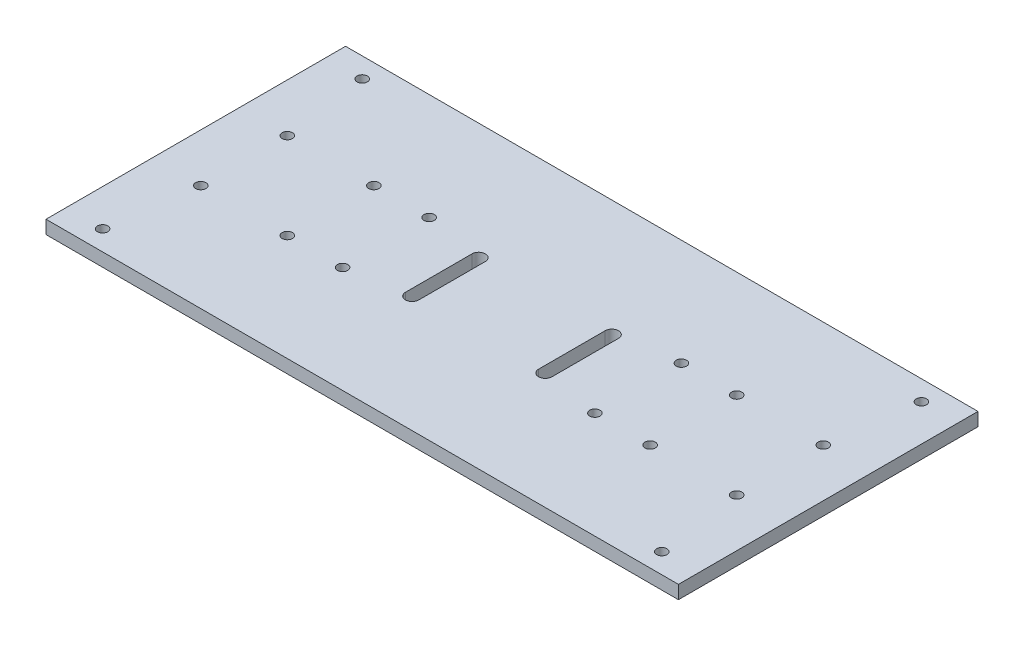
ISO-10303-21;
HEADER;
FILE_DESCRIPTION(('STEP AP214'),'2;1');
FILE_NAME('part.step','',(''),(''),'','','');
FILE_SCHEMA(('AUTOMOTIVE_DESIGN { 1 0 10303 214 1 1 1 1 }'));
ENDSEC;
DATA;
#1=APPLICATION_CONTEXT('core data for automotive mechanical design processes');
#2=APPLICATION_PROTOCOL_DEFINITION('international standard','automotive_design',2000,#1);
#3=PRODUCT_CONTEXT('',#1,'mechanical');
#4=PRODUCT('Part','Part','',(#3));
#5=PRODUCT_RELATED_PRODUCT_CATEGORY('part','',(#4));
#6=PRODUCT_DEFINITION_FORMATION('','',#4);
#7=PRODUCT_DEFINITION_CONTEXT('part definition',#1,'design');
#8=PRODUCT_DEFINITION('design','',#6,#7);
#9=PRODUCT_DEFINITION_SHAPE('','',#8);
#10=(LENGTH_UNIT() NAMED_UNIT(*) SI_UNIT(.MILLI.,.METRE.));
#11=(NAMED_UNIT(*) PLANE_ANGLE_UNIT() SI_UNIT($,.RADIAN.));
#12=(NAMED_UNIT(*) SI_UNIT($,.STERADIAN.) SOLID_ANGLE_UNIT());
#13=UNCERTAINTY_MEASURE_WITH_UNIT(LENGTH_MEASURE(1.E-05),#10,'distance_accuracy_value','');
#14=(GEOMETRIC_REPRESENTATION_CONTEXT(3) GLOBAL_UNCERTAINTY_ASSIGNED_CONTEXT((#13)) GLOBAL_UNIT_ASSIGNED_CONTEXT((#10,
#11,#12)) REPRESENTATION_CONTEXT('',''));
#15=CARTESIAN_POINT('',(0.,0.,0.));
#16=DIRECTION('',(0.,0.,1.));
#17=DIRECTION('',(1.,0.,0.));
#18=AXIS2_PLACEMENT_3D('',#15,#16,#17);
#19=CARTESIAN_POINT('',(0.,4.,0.));
#20=DIRECTION('',(0.,-1.,0.));
#21=DIRECTION('',(0.,0.,-1.));
#22=AXIS2_PLACEMENT_3D('',#19,#20,#21);
#23=PLANE('',#22);
#24=CARTESIAN_POINT('',(70.,4.,-35.));
#25=DIRECTION('',(0.,1.,0.));
#26=DIRECTION('',(0.,0.,1.));
#27=AXIS2_PLACEMENT_3D('',#24,#25,#26);
#28=CIRCLE('',#27,2.);
#29=CARTESIAN_POINT('',(68.,4.,-35.));
#30=VERTEX_POINT('',#29);
#31=CARTESIAN_POINT('',(72.,4.,-35.));
#32=VERTEX_POINT('',#31);
#33=EDGE_CURVE('E215',#30,#32,#28,.T.);
#34=ORIENTED_EDGE('',*,*,#33,.F.);
#35=DIRECTION('',(0.,0.,1.));
#36=VECTOR('',#35,1.);
#37=CARTESIAN_POINT('',(68.,4.,-35.));
#38=LINE('',#37,#36);
#39=CARTESIAN_POINT('',(68.,4.,-55.));
#40=VERTEX_POINT('',#39);
#41=EDGE_CURVE('E226',#40,#30,#38,.T.);
#42=ORIENTED_EDGE('',*,*,#41,.F.);
#43=CARTESIAN_POINT('',(70.,4.,-55.));
#44=DIRECTION('',(0.,1.,0.));
#45=DIRECTION('',(0.,0.,1.));
#46=AXIS2_PLACEMENT_3D('',#43,#44,#45);
#47=CIRCLE('',#46,2.);
#48=CARTESIAN_POINT('',(72.,4.,-55.));
#49=VERTEX_POINT('',#48);
#50=EDGE_CURVE('E222',#49,#40,#47,.T.);
#51=ORIENTED_EDGE('',*,*,#50,.F.);
#52=DIRECTION('',(0.,0.,-1.));
#53=VECTOR('',#52,1.);
#54=CARTESIAN_POINT('',(72.,4.,-35.));
#55=LINE('',#54,#53);
#56=EDGE_CURVE('E218',#32,#49,#55,.T.);
#57=ORIENTED_EDGE('',*,*,#56,.F.);
#58=EDGE_LOOP('',(#34,#42,#51,#57));
#59=FACE_BOUND('',#58,.T.);
#60=DIRECTION('',(-1.,0.,0.));
#61=VECTOR('',#60,1.);
#62=CARTESIAN_POINT('',(0.,4.,-90.));
#63=LINE('',#62,#61);
#64=CARTESIAN_POINT('',(185.,4.,-90.));
#65=VERTEX_POINT('',#64);
#66=CARTESIAN_POINT('',(-5.,4.,-90.));
#67=VERTEX_POINT('',#66);
#68=EDGE_CURVE('E11',#65,#67,#63,.T.);
#69=ORIENTED_EDGE('',*,*,#68,.T.);
#70=DIRECTION('',(0.,0.,-1.));
#71=VECTOR('',#70,1.);
#72=CARTESIAN_POINT('',(-5.,4.,-90.));
#73=LINE('',#72,#71);
#74=CARTESIAN_POINT('',(-5.,4.,0.));
#75=VERTEX_POINT('',#74);
#76=EDGE_CURVE('E173',#75,#67,#73,.T.);
#77=ORIENTED_EDGE('',*,*,#76,.F.);
#78=DIRECTION('',(1.,0.,0.));
#79=VECTOR('',#78,1.);
#80=CARTESIAN_POINT('',(0.,4.,0.));
#81=LINE('',#80,#79);
#82=CARTESIAN_POINT('',(185.,4.,0.));
#83=VERTEX_POINT('',#82);
#84=EDGE_CURVE('E49',#75,#83,#81,.T.);
#85=ORIENTED_EDGE('',*,*,#84,.T.);
#86=DIRECTION('',(0.,0.,1.));
#87=VECTOR('',#86,1.);
#88=CARTESIAN_POINT('',(185.,4.,0.));
#89=LINE('',#88,#87);
#90=EDGE_CURVE('E156',#65,#83,#89,.T.);
#91=ORIENTED_EDGE('',*,*,#90,.F.);
#92=EDGE_LOOP('',(#69,#77,#85,#91));
#93=FACE_BOUND('',#92,.T.);
#94=CARTESIAN_POINT('',(9.5,4.,-58.));
#95=DIRECTION('',(0.,1.,0.));
#96=DIRECTION('',(0.,0.,1.));
#97=AXIS2_PLACEMENT_3D('',#94,#95,#96);
#98=CIRCLE('',#97,1.55);
#99=CARTESIAN_POINT('',(9.5,4.,-56.45));
#100=VERTEX_POINT('',#99);
#101=EDGE_CURVE('E142',#100,#100,#98,.T.);
#102=ORIENTED_EDGE('',*,*,#101,.F.);
#103=EDGE_LOOP('',(#102));
#104=FACE_BOUND('',#103,.T.);
#105=CARTESIAN_POINT('',(144.5,4.,-58.));
#106=DIRECTION('',(0.,1.,0.));
#107=DIRECTION('',(0.,0.,-1.));
#108=AXIS2_PLACEMENT_3D('',#105,#106,#107);
#109=CIRCLE('',#108,1.54999999999999);
#110=CARTESIAN_POINT('',(144.5,4.,-59.55));
#111=VERTEX_POINT('',#110);
#112=EDGE_CURVE('E370',#111,#111,#109,.T.);
#113=ORIENTED_EDGE('',*,*,#112,.F.);
#114=EDGE_LOOP('',(#113));
#115=FACE_BOUND('',#114,.T.);
#116=CARTESIAN_POINT('',(35.5,4.,-58.0000000000003));
#117=DIRECTION('',(0.,1.,0.));
#118=DIRECTION('',(0.,0.,1.));
#119=AXIS2_PLACEMENT_3D('',#116,#117,#118);
#120=CIRCLE('',#119,1.55);
#121=CARTESIAN_POINT('',(35.5,4.,-56.4500000000003));
#122=VERTEX_POINT('',#121);
#123=EDGE_CURVE('E362',#122,#122,#120,.T.);
#124=ORIENTED_EDGE('',*,*,#123,.F.);
#125=EDGE_LOOP('',(#124));
#126=FACE_BOUND('',#125,.T.);
#127=CARTESIAN_POINT('',(35.5000000000003,4.,-32.0000000000003));
#128=DIRECTION('',(0.,1.,0.));
#129=DIRECTION('',(0.,0.,1.));
#130=AXIS2_PLACEMENT_3D('',#127,#128,#129);
#131=CIRCLE('',#130,1.55);
#132=CARTESIAN_POINT('',(35.5000000000003,4.,-30.4500000000003));
#133=VERTEX_POINT('',#132);
#134=EDGE_CURVE('E354',#133,#133,#131,.T.);
#135=ORIENTED_EDGE('',*,*,#134,.F.);
#136=EDGE_LOOP('',(#135));
#137=FACE_BOUND('',#136,.T.);
#138=CARTESIAN_POINT('',(9.5,4.,-32.));
#139=DIRECTION('',(0.,1.,0.));
#140=DIRECTION('',(0.,0.,1.));
#141=AXIS2_PLACEMENT_3D('',#138,#139,#140);
#142=CIRCLE('',#141,1.55);
#143=CARTESIAN_POINT('',(9.5,4.,-30.45));
#144=VERTEX_POINT('',#143);
#145=EDGE_CURVE('E346',#144,#144,#142,.T.);
#146=ORIENTED_EDGE('',*,*,#145,.F.);
#147=EDGE_LOOP('',(#146));
#148=FACE_BOUND('',#147,.T.);
#149=CARTESIAN_POINT('',(170.5,4.,-58.));
#150=DIRECTION('',(0.,1.,0.));
#151=DIRECTION('',(0.,0.,-1.));
#152=AXIS2_PLACEMENT_3D('',#149,#150,#151);
#153=CIRCLE('',#152,1.54999999999999);
#154=CARTESIAN_POINT('',(170.5,4.,-59.55));
#155=VERTEX_POINT('',#154);
#156=EDGE_CURVE('E338',#155,#155,#153,.T.);
#157=ORIENTED_EDGE('',*,*,#156,.F.);
#158=EDGE_LOOP('',(#157));
#159=FACE_BOUND('',#158,.T.);
#160=CARTESIAN_POINT('',(170.5,4.,-32.));
#161=DIRECTION('',(0.,1.,0.));
#162=DIRECTION('',(0.,0.,-1.));
#163=AXIS2_PLACEMENT_3D('',#160,#161,#162);
#164=CIRCLE('',#163,1.54999999999999);
#165=CARTESIAN_POINT('',(170.5,4.,-33.55));
#166=VERTEX_POINT('',#165);
#167=EDGE_CURVE('E330',#166,#166,#164,.T.);
#168=ORIENTED_EDGE('',*,*,#167,.F.);
#169=EDGE_LOOP('',(#168));
#170=FACE_BOUND('',#169,.T.);
#171=CARTESIAN_POINT('',(144.5,4.,-32.));
#172=DIRECTION('',(0.,1.,0.));
#173=DIRECTION('',(0.,0.,-1.));
#174=AXIS2_PLACEMENT_3D('',#171,#172,#173);
#175=CIRCLE('',#174,1.54999999999999);
#176=CARTESIAN_POINT('',(144.5,4.,-33.55));
#177=VERTEX_POINT('',#176);
#178=EDGE_CURVE('E322',#177,#177,#175,.T.);
#179=ORIENTED_EDGE('',*,*,#178,.F.);
#180=EDGE_LOOP('',(#179));
#181=FACE_BOUND('',#180,.T.);
#182=CARTESIAN_POINT('',(127.9,4.,-58.));
#183=DIRECTION('',(0.,1.,0.));
#184=DIRECTION('',(0.,0.,1.));
#185=AXIS2_PLACEMENT_3D('',#182,#183,#184);
#186=CIRCLE('',#185,1.54999999999999);
#187=CARTESIAN_POINT('',(127.9,4.,-56.45));
#188=VERTEX_POINT('',#187);
#189=EDGE_CURVE('E314',#188,#188,#186,.T.);
#190=ORIENTED_EDGE('',*,*,#189,.F.);
#191=EDGE_LOOP('',(#190));
#192=FACE_BOUND('',#191,.T.);
#193=CARTESIAN_POINT('',(174.,4.,-84.));
#194=DIRECTION('',(0.,1.,0.));
#195=DIRECTION('',(0.,0.,1.));
#196=AXIS2_PLACEMENT_3D('',#193,#194,#195);
#197=CIRCLE('',#196,1.54999999999999);
#198=CARTESIAN_POINT('',(174.,4.,-82.45));
#199=VERTEX_POINT('',#198);
#200=EDGE_CURVE('E306',#199,#199,#197,.T.);
#201=ORIENTED_EDGE('',*,*,#200,.F.);
#202=EDGE_LOOP('',(#201));
#203=FACE_BOUND('',#202,.T.);
#204=CARTESIAN_POINT('',(52.1,4.,-58.));
#205=DIRECTION('',(0.,1.,0.));
#206=DIRECTION('',(0.,0.,-1.));
#207=AXIS2_PLACEMENT_3D('',#204,#205,#206);
#208=CIRCLE('',#207,1.54999999999999);
#209=CARTESIAN_POINT('',(52.1,4.,-59.55));
#210=VERTEX_POINT('',#209);
#211=EDGE_CURVE('E298',#210,#210,#208,.T.);
#212=ORIENTED_EDGE('',*,*,#211,.F.);
#213=EDGE_LOOP('',(#212));
#214=FACE_BOUND('',#213,.T.);
#215=CARTESIAN_POINT('',(127.9,4.,-32.));
#216=DIRECTION('',(0.,1.,0.));
#217=DIRECTION('',(0.,0.,-1.));
#218=AXIS2_PLACEMENT_3D('',#215,#216,#217);
#219=CIRCLE('',#218,1.54999999999999);
#220=CARTESIAN_POINT('',(127.9,4.,-33.55));
#221=VERTEX_POINT('',#220);
#222=EDGE_CURVE('E290',#221,#221,#219,.T.);
#223=ORIENTED_EDGE('',*,*,#222,.F.);
#224=EDGE_LOOP('',(#223));
#225=FACE_BOUND('',#224,.T.);
#226=CARTESIAN_POINT('',(52.1,4.,-32.));
#227=DIRECTION('',(0.,1.,0.));
#228=DIRECTION('',(0.,0.,1.));
#229=AXIS2_PLACEMENT_3D('',#226,#227,#228);
#230=CIRCLE('',#229,1.54999999999999);
#231=CARTESIAN_POINT('',(52.1,4.,-30.45));
#232=VERTEX_POINT('',#231);
#233=EDGE_CURVE('E282',#232,#232,#230,.T.);
#234=ORIENTED_EDGE('',*,*,#233,.F.);
#235=EDGE_LOOP('',(#234));
#236=FACE_BOUND('',#235,.T.);
#237=CARTESIAN_POINT('',(174.,4.,-6.00000000000001));
#238=DIRECTION('',(0.,1.,0.));
#239=DIRECTION('',(0.,0.,-1.));
#240=AXIS2_PLACEMENT_3D('',#237,#238,#239);
#241=CIRCLE('',#240,1.54999999999999);
#242=CARTESIAN_POINT('',(174.,4.,-7.55));
#243=VERTEX_POINT('',#242);
#244=EDGE_CURVE('E274',#243,#243,#241,.T.);
#245=ORIENTED_EDGE('',*,*,#244,.F.);
#246=EDGE_LOOP('',(#245));
#247=FACE_BOUND('',#246,.T.);
#248=CARTESIAN_POINT('',(6.00000000000001,4.,-6.00000000000003));
#249=DIRECTION('',(0.,1.,0.));
#250=DIRECTION('',(0.,0.,1.));
#251=AXIS2_PLACEMENT_3D('',#248,#249,#250);
#252=CIRCLE('',#251,1.55);
#253=CARTESIAN_POINT('',(6.00000000000001,4.,-4.45000000000003));
#254=VERTEX_POINT('',#253);
#255=EDGE_CURVE('E266',#254,#254,#252,.T.);
#256=ORIENTED_EDGE('',*,*,#255,.F.);
#257=EDGE_LOOP('',(#256));
#258=FACE_BOUND('',#257,.T.);
#259=CARTESIAN_POINT('',(6.00000000000001,4.,-84.));
#260=DIRECTION('',(0.,1.,0.));
#261=DIRECTION('',(0.,0.,-1.));
#262=AXIS2_PLACEMENT_3D('',#259,#260,#261);
#263=CIRCLE('',#262,1.55);
#264=CARTESIAN_POINT('',(6.00000000000001,4.,-85.55));
#265=VERTEX_POINT('',#264);
#266=EDGE_CURVE('E258',#265,#265,#263,.T.);
#267=ORIENTED_EDGE('',*,*,#266,.F.);
#268=EDGE_LOOP('',(#267));
#269=FACE_BOUND('',#268,.T.);
#270=CARTESIAN_POINT('',(110.,4.,-35.0000000000001));
#271=DIRECTION('',(0.,1.,0.));
#272=DIRECTION('',(0.,0.,-1.));
#273=AXIS2_PLACEMENT_3D('',#270,#271,#272);
#274=CIRCLE('',#273,2.);
#275=CARTESIAN_POINT('',(108.,4.,-35.));
#276=VERTEX_POINT('',#275);
#277=CARTESIAN_POINT('',(112.,4.,-35.));
#278=VERTEX_POINT('',#277);
#279=EDGE_CURVE('E177',#276,#278,#274,.T.);
#280=ORIENTED_EDGE('',*,*,#279,.F.);
#281=DIRECTION('',(0.,0.,1.));
#282=VECTOR('',#281,1.);
#283=CARTESIAN_POINT('',(108.,4.,-35.));
#284=LINE('',#283,#282);
#285=CARTESIAN_POINT('',(108.,4.,-55.));
#286=VERTEX_POINT('',#285);
#287=EDGE_CURVE('E187',#286,#276,#284,.T.);
#288=ORIENTED_EDGE('',*,*,#287,.F.);
#289=CARTESIAN_POINT('',(110.,4.,-55.0000000000001));
#290=DIRECTION('',(0.,1.,0.));
#291=DIRECTION('',(0.,0.,-1.));
#292=AXIS2_PLACEMENT_3D('',#289,#290,#291);
#293=CIRCLE('',#292,2.);
#294=CARTESIAN_POINT('',(112.,4.,-55.));
#295=VERTEX_POINT('',#294);
#296=EDGE_CURVE('E184',#295,#286,#293,.T.);
#297=ORIENTED_EDGE('',*,*,#296,.F.);
#298=DIRECTION('',(0.,0.,-1.));
#299=VECTOR('',#298,1.);
#300=CARTESIAN_POINT('',(112.,4.,-35.));
#301=LINE('',#300,#299);
#302=EDGE_CURVE('E180',#278,#295,#301,.T.);
#303=ORIENTED_EDGE('',*,*,#302,.F.);
#304=EDGE_LOOP('',(#280,#288,#297,#303));
#305=FACE_BOUND('',#304,.T.);
#306=ADVANCED_FACE('F39',(#59,#93,#104,#115,#126,#137,#148,#159,#170,#181,#192,#203,#214,#225,
#236,#247,#258,#269,#305),#23,.F.);
#307=CARTESIAN_POINT('',(0.,0.,0.));
#308=DIRECTION('',(0.,-1.,0.));
#309=DIRECTION('',(0.,0.,-1.));
#310=AXIS2_PLACEMENT_3D('',#307,#308,#309);
#311=PLANE('',#310);
#312=CARTESIAN_POINT('',(6.00000000000001,0.,-6.00000000000003));
#313=DIRECTION('',(0.,1.,0.));
#314=DIRECTION('',(0.,0.,1.));
#315=AXIS2_PLACEMENT_3D('',#312,#313,#314);
#316=CIRCLE('',#315,1.55);
#317=CARTESIAN_POINT('',(6.00000000000001,0.,-4.45000000000003));
#318=VERTEX_POINT('',#317);
#319=EDGE_CURVE('E262',#318,#318,#316,.T.);
#320=ORIENTED_EDGE('',*,*,#319,.T.);
#321=EDGE_LOOP('',(#320));
#322=FACE_BOUND('',#321,.T.);
#323=CARTESIAN_POINT('',(52.1,0.,-32.));
#324=DIRECTION('',(0.,1.,0.));
#325=DIRECTION('',(0.,0.,1.));
#326=AXIS2_PLACEMENT_3D('',#323,#324,#325);
#327=CIRCLE('',#326,1.54999999999999);
#328=CARTESIAN_POINT('',(52.1,0.,-30.45));
#329=VERTEX_POINT('',#328);
#330=EDGE_CURVE('E278',#329,#329,#327,.T.);
#331=ORIENTED_EDGE('',*,*,#330,.T.);
#332=EDGE_LOOP('',(#331));
#333=FACE_BOUND('',#332,.T.);
#334=CARTESIAN_POINT('',(52.1,0.,-58.));
#335=DIRECTION('',(0.,1.,0.));
#336=DIRECTION('',(0.,0.,-1.));
#337=AXIS2_PLACEMENT_3D('',#334,#335,#336);
#338=CIRCLE('',#337,1.54999999999999);
#339=CARTESIAN_POINT('',(52.1,0.,-59.55));
#340=VERTEX_POINT('',#339);
#341=EDGE_CURVE('E294',#340,#340,#338,.T.);
#342=ORIENTED_EDGE('',*,*,#341,.T.);
#343=EDGE_LOOP('',(#342));
#344=FACE_BOUND('',#343,.T.);
#345=CARTESIAN_POINT('',(127.9,0.,-58.));
#346=DIRECTION('',(0.,1.,0.));
#347=DIRECTION('',(0.,0.,1.));
#348=AXIS2_PLACEMENT_3D('',#345,#346,#347);
#349=CIRCLE('',#348,1.54999999999999);
#350=CARTESIAN_POINT('',(127.9,0.,-56.45));
#351=VERTEX_POINT('',#350);
#352=EDGE_CURVE('E310',#351,#351,#349,.T.);
#353=ORIENTED_EDGE('',*,*,#352,.T.);
#354=EDGE_LOOP('',(#353));
#355=FACE_BOUND('',#354,.T.);
#356=CARTESIAN_POINT('',(170.5,0.,-32.));
#357=DIRECTION('',(0.,1.,0.));
#358=DIRECTION('',(0.,0.,-1.));
#359=AXIS2_PLACEMENT_3D('',#356,#357,#358);
#360=CIRCLE('',#359,1.54999999999999);
#361=CARTESIAN_POINT('',(170.5,0.,-33.55));
#362=VERTEX_POINT('',#361);
#363=EDGE_CURVE('E326',#362,#362,#360,.T.);
#364=ORIENTED_EDGE('',*,*,#363,.T.);
#365=EDGE_LOOP('',(#364));
#366=FACE_BOUND('',#365,.T.);
#367=CARTESIAN_POINT('',(9.5,0.,-32.));
#368=DIRECTION('',(0.,1.,0.));
#369=DIRECTION('',(0.,0.,1.));
#370=AXIS2_PLACEMENT_3D('',#367,#368,#369);
#371=CIRCLE('',#370,1.55);
#372=CARTESIAN_POINT('',(9.5,0.,-30.45));
#373=VERTEX_POINT('',#372);
#374=EDGE_CURVE('E342',#373,#373,#371,.T.);
#375=ORIENTED_EDGE('',*,*,#374,.T.);
#376=EDGE_LOOP('',(#375));
#377=FACE_BOUND('',#376,.T.);
#378=CARTESIAN_POINT('',(35.5,0.,-58.0000000000003));
#379=DIRECTION('',(0.,1.,0.));
#380=DIRECTION('',(0.,0.,1.));
#381=AXIS2_PLACEMENT_3D('',#378,#379,#380);
#382=CIRCLE('',#381,1.55);
#383=CARTESIAN_POINT('',(35.5,0.,-56.4500000000003));
#384=VERTEX_POINT('',#383);
#385=EDGE_CURVE('E358',#384,#384,#382,.T.);
#386=ORIENTED_EDGE('',*,*,#385,.T.);
#387=EDGE_LOOP('',(#386));
#388=FACE_BOUND('',#387,.T.);
#389=CARTESIAN_POINT('',(9.5,0.,-58.));
#390=DIRECTION('',(0.,1.,0.));
#391=DIRECTION('',(0.,0.,1.));
#392=AXIS2_PLACEMENT_3D('',#389,#390,#391);
#393=CIRCLE('',#392,1.55);
#394=CARTESIAN_POINT('',(9.5,0.,-56.45));
#395=VERTEX_POINT('',#394);
#396=EDGE_CURVE('E374',#395,#395,#393,.T.);
#397=ORIENTED_EDGE('',*,*,#396,.T.);
#398=EDGE_LOOP('',(#397));
#399=FACE_BOUND('',#398,.T.);
#400=DIRECTION('',(1.,0.,0.));
#401=VECTOR('',#400,1.);
#402=CARTESIAN_POINT('',(0.,0.,0.));
#403=LINE('',#402,#401);
#404=CARTESIAN_POINT('',(-5.,0.,0.));
#405=VERTEX_POINT('',#404);
#406=CARTESIAN_POINT('',(185.,0.,0.));
#407=VERTEX_POINT('',#406);
#408=EDGE_CURVE('E132',#405,#407,#403,.T.);
#409=ORIENTED_EDGE('',*,*,#408,.F.);
#410=DIRECTION('',(0.,0.,1.));
#411=VECTOR('',#410,1.);
#412=CARTESIAN_POINT('',(-5.,0.,-90.));
#413=LINE('',#412,#411);
#414=CARTESIAN_POINT('',(-5.,0.,-90.));
#415=VERTEX_POINT('',#414);
#416=EDGE_CURVE('E168',#415,#405,#413,.T.);
#417=ORIENTED_EDGE('',*,*,#416,.F.);
#418=DIRECTION('',(-1.,0.,0.));
#419=VECTOR('',#418,1.);
#420=CARTESIAN_POINT('',(0.,0.,-90.));
#421=LINE('',#420,#419);
#422=CARTESIAN_POINT('',(185.,0.,-90.));
#423=VERTEX_POINT('',#422);
#424=EDGE_CURVE('E43',#423,#415,#421,.T.);
#425=ORIENTED_EDGE('',*,*,#424,.F.);
#426=DIRECTION('',(0.,0.,-1.));
#427=VECTOR('',#426,1.);
#428=CARTESIAN_POINT('',(185.,0.,0.));
#429=LINE('',#428,#427);
#430=EDGE_CURVE('E144',#407,#423,#429,.T.);
#431=ORIENTED_EDGE('',*,*,#430,.F.);
#432=EDGE_LOOP('',(#409,#417,#425,#431));
#433=FACE_BOUND('',#432,.T.);
#434=CARTESIAN_POINT('',(144.5,0.,-58.));
#435=DIRECTION('',(0.,1.,0.));
#436=DIRECTION('',(0.,0.,-1.));
#437=AXIS2_PLACEMENT_3D('',#434,#435,#436);
#438=CIRCLE('',#437,1.54999999999999);
#439=CARTESIAN_POINT('',(144.5,0.,-59.55));
#440=VERTEX_POINT('',#439);
#441=EDGE_CURVE('E366',#440,#440,#438,.T.);
#442=ORIENTED_EDGE('',*,*,#441,.T.);
#443=EDGE_LOOP('',(#442));
#444=FACE_BOUND('',#443,.T.);
#445=CARTESIAN_POINT('',(35.5000000000003,0.,-32.0000000000003));
#446=DIRECTION('',(0.,1.,0.));
#447=DIRECTION('',(0.,0.,1.));
#448=AXIS2_PLACEMENT_3D('',#445,#446,#447);
#449=CIRCLE('',#448,1.55);
#450=CARTESIAN_POINT('',(35.5000000000003,0.,-30.4500000000003));
#451=VERTEX_POINT('',#450);
#452=EDGE_CURVE('E350',#451,#451,#449,.T.);
#453=ORIENTED_EDGE('',*,*,#452,.T.);
#454=EDGE_LOOP('',(#453));
#455=FACE_BOUND('',#454,.T.);
#456=CARTESIAN_POINT('',(170.5,0.,-58.));
#457=DIRECTION('',(0.,1.,0.));
#458=DIRECTION('',(0.,0.,-1.));
#459=AXIS2_PLACEMENT_3D('',#456,#457,#458);
#460=CIRCLE('',#459,1.54999999999999);
#461=CARTESIAN_POINT('',(170.5,0.,-59.55));
#462=VERTEX_POINT('',#461);
#463=EDGE_CURVE('E334',#462,#462,#460,.T.);
#464=ORIENTED_EDGE('',*,*,#463,.T.);
#465=EDGE_LOOP('',(#464));
#466=FACE_BOUND('',#465,.T.);
#467=CARTESIAN_POINT('',(144.5,0.,-32.));
#468=DIRECTION('',(0.,1.,0.));
#469=DIRECTION('',(0.,0.,-1.));
#470=AXIS2_PLACEMENT_3D('',#467,#468,#469);
#471=CIRCLE('',#470,1.54999999999999);
#472=CARTESIAN_POINT('',(144.5,0.,-33.55));
#473=VERTEX_POINT('',#472);
#474=EDGE_CURVE('E318',#473,#473,#471,.T.);
#475=ORIENTED_EDGE('',*,*,#474,.T.);
#476=EDGE_LOOP('',(#475));
#477=FACE_BOUND('',#476,.T.);
#478=CARTESIAN_POINT('',(174.,0.,-84.));
#479=DIRECTION('',(0.,1.,0.));
#480=DIRECTION('',(0.,0.,1.));
#481=AXIS2_PLACEMENT_3D('',#478,#479,#480);
#482=CIRCLE('',#481,1.54999999999999);
#483=CARTESIAN_POINT('',(174.,0.,-82.45));
#484=VERTEX_POINT('',#483);
#485=EDGE_CURVE('E302',#484,#484,#482,.T.);
#486=ORIENTED_EDGE('',*,*,#485,.T.);
#487=EDGE_LOOP('',(#486));
#488=FACE_BOUND('',#487,.T.);
#489=CARTESIAN_POINT('',(127.9,0.,-32.));
#490=DIRECTION('',(0.,1.,0.));
#491=DIRECTION('',(0.,0.,-1.));
#492=AXIS2_PLACEMENT_3D('',#489,#490,#491);
#493=CIRCLE('',#492,1.54999999999999);
#494=CARTESIAN_POINT('',(127.9,0.,-33.55));
#495=VERTEX_POINT('',#494);
#496=EDGE_CURVE('E286',#495,#495,#493,.T.);
#497=ORIENTED_EDGE('',*,*,#496,.T.);
#498=EDGE_LOOP('',(#497));
#499=FACE_BOUND('',#498,.T.);
#500=CARTESIAN_POINT('',(174.,0.,-6.00000000000001));
#501=DIRECTION('',(0.,1.,0.));
#502=DIRECTION('',(0.,0.,-1.));
#503=AXIS2_PLACEMENT_3D('',#500,#501,#502);
#504=CIRCLE('',#503,1.54999999999999);
#505=CARTESIAN_POINT('',(174.,0.,-7.55));
#506=VERTEX_POINT('',#505);
#507=EDGE_CURVE('E270',#506,#506,#504,.T.);
#508=ORIENTED_EDGE('',*,*,#507,.T.);
#509=EDGE_LOOP('',(#508));
#510=FACE_BOUND('',#509,.T.);
#511=CARTESIAN_POINT('',(6.00000000000001,0.,-84.));
#512=DIRECTION('',(0.,1.,0.));
#513=DIRECTION('',(0.,0.,-1.));
#514=AXIS2_PLACEMENT_3D('',#511,#512,#513);
#515=CIRCLE('',#514,1.55);
#516=CARTESIAN_POINT('',(6.00000000000001,0.,-85.55));
#517=VERTEX_POINT('',#516);
#518=EDGE_CURVE('E257',#517,#517,#515,.T.);
#519=ORIENTED_EDGE('',*,*,#518,.T.);
#520=EDGE_LOOP('',(#519));
#521=FACE_BOUND('',#520,.T.);
#522=DIRECTION('',(0.,0.,1.));
#523=VECTOR('',#522,1.);
#524=CARTESIAN_POINT('',(68.,0.,-35.));
#525=LINE('',#524,#523);
#526=CARTESIAN_POINT('',(68.,0.,-55.));
#527=VERTEX_POINT('',#526);
#528=CARTESIAN_POINT('',(68.,0.,-35.));
#529=VERTEX_POINT('',#528);
#530=EDGE_CURVE('E219',#527,#529,#525,.T.);
#531=ORIENTED_EDGE('',*,*,#530,.T.);
#532=CARTESIAN_POINT('',(70.,0.,-35.));
#533=DIRECTION('',(0.,1.,0.));
#534=DIRECTION('',(0.,0.,1.));
#535=AXIS2_PLACEMENT_3D('',#532,#533,#534);
#536=CIRCLE('',#535,2.);
#537=CARTESIAN_POINT('',(72.,0.,-35.));
#538=VERTEX_POINT('',#537);
#539=EDGE_CURVE('E214',#529,#538,#536,.T.);
#540=ORIENTED_EDGE('',*,*,#539,.T.);
#541=DIRECTION('',(0.,0.,-1.));
#542=VECTOR('',#541,1.);
#543=CARTESIAN_POINT('',(72.,0.,-35.));
#544=LINE('',#543,#542);
#545=CARTESIAN_POINT('',(72.,0.,-55.));
#546=VERTEX_POINT('',#545);
#547=EDGE_CURVE('E233',#538,#546,#544,.T.);
#548=ORIENTED_EDGE('',*,*,#547,.T.);
#549=CARTESIAN_POINT('',(70.,0.,-55.));
#550=DIRECTION('',(0.,1.,0.));
#551=DIRECTION('',(0.,0.,1.));
#552=AXIS2_PLACEMENT_3D('',#549,#550,#551);
#553=CIRCLE('',#552,2.);
#554=EDGE_CURVE('E237',#546,#527,#553,.T.);
#555=ORIENTED_EDGE('',*,*,#554,.T.);
#556=EDGE_LOOP('',(#531,#540,#548,#555));
#557=FACE_BOUND('',#556,.T.);
#558=DIRECTION('',(0.,0.,1.));
#559=VECTOR('',#558,1.);
#560=CARTESIAN_POINT('',(108.,0.,-35.));
#561=LINE('',#560,#559);
#562=CARTESIAN_POINT('',(108.,0.,-55.));
#563=VERTEX_POINT('',#562);
#564=CARTESIAN_POINT('',(108.,0.,-35.));
#565=VERTEX_POINT('',#564);
#566=EDGE_CURVE('E181',#563,#565,#561,.T.);
#567=ORIENTED_EDGE('',*,*,#566,.T.);
#568=CARTESIAN_POINT('',(110.,0.,-35.0000000000001));
#569=DIRECTION('',(0.,1.,0.));
#570=DIRECTION('',(0.,0.,-1.));
#571=AXIS2_PLACEMENT_3D('',#568,#569,#570);
#572=CIRCLE('',#571,2.);
#573=CARTESIAN_POINT('',(112.,0.,-35.));
#574=VERTEX_POINT('',#573);
#575=EDGE_CURVE('E65',#565,#574,#572,.T.);
#576=ORIENTED_EDGE('',*,*,#575,.T.);
#577=DIRECTION('',(0.,0.,-1.));
#578=VECTOR('',#577,1.);
#579=CARTESIAN_POINT('',(112.,0.,-35.));
#580=LINE('',#579,#578);
#581=CARTESIAN_POINT('',(112.,0.,-55.));
#582=VERTEX_POINT('',#581);
#583=EDGE_CURVE('E193',#574,#582,#580,.T.);
#584=ORIENTED_EDGE('',*,*,#583,.T.);
#585=CARTESIAN_POINT('',(110.,0.,-55.0000000000001));
#586=DIRECTION('',(0.,1.,0.));
#587=DIRECTION('',(0.,0.,-1.));
#588=AXIS2_PLACEMENT_3D('',#585,#586,#587);
#589=CIRCLE('',#588,2.);
#590=EDGE_CURVE('E197',#582,#563,#589,.T.);
#591=ORIENTED_EDGE('',*,*,#590,.T.);
#592=EDGE_LOOP('',(#567,#576,#584,#591));
#593=FACE_BOUND('',#592,.T.);
#594=ADVANCED_FACE('F145',(#322,#333,#344,#355,#366,#377,#388,#399,#433,#444,#455,#466,#477,
#488,#499,#510,#521,#557,#593),#311,.T.);
#595=CARTESIAN_POINT('',(0.,4.,0.));
#596=DIRECTION('',(0.,0.,-1.));
#597=DIRECTION('',(-1.,0.,0.));
#598=AXIS2_PLACEMENT_3D('',#595,#596,#597);
#599=PLANE('',#598);
#600=ORIENTED_EDGE('',*,*,#408,.T.);
#601=DIRECTION('',(0.,-1.,0.));
#602=VECTOR('',#601,1.);
#603=CARTESIAN_POINT('',(185.,0.,0.));
#604=LINE('',#603,#602);
#605=EDGE_CURVE('E135',#83,#407,#604,.T.);
#606=ORIENTED_EDGE('',*,*,#605,.F.);
#607=ORIENTED_EDGE('',*,*,#84,.F.);
#608=DIRECTION('',(0.,1.,0.));
#609=VECTOR('',#608,1.);
#610=CARTESIAN_POINT('',(-5.,4.,0.));
#611=LINE('',#610,#609);
#612=EDGE_CURVE('E137',#405,#75,#611,.T.);
#613=ORIENTED_EDGE('',*,*,#612,.F.);
#614=EDGE_LOOP('',(#600,#606,#607,#613));
#615=FACE_BOUND('',#614,.T.);
#616=ADVANCED_FACE('F41',(#615),#599,.F.);
#617=CARTESIAN_POINT('',(0.,4.,-90.));
#618=DIRECTION('',(0.,0.,1.));
#619=DIRECTION('',(1.,0.,0.));
#620=AXIS2_PLACEMENT_3D('',#617,#618,#619);
#621=PLANE('',#620);
#622=ORIENTED_EDGE('',*,*,#424,.T.);
#623=DIRECTION('',(0.,-1.,0.));
#624=VECTOR('',#623,1.);
#625=CARTESIAN_POINT('',(-5.,4.,-90.));
#626=LINE('',#625,#624);
#627=EDGE_CURVE('E164',#67,#415,#626,.T.);
#628=ORIENTED_EDGE('',*,*,#627,.F.);
#629=ORIENTED_EDGE('',*,*,#68,.F.);
#630=DIRECTION('',(0.,1.,0.));
#631=VECTOR('',#630,1.);
#632=CARTESIAN_POINT('',(185.,0.,-90.));
#633=LINE('',#632,#631);
#634=EDGE_CURVE('E151',#423,#65,#633,.T.);
#635=ORIENTED_EDGE('',*,*,#634,.F.);
#636=EDGE_LOOP('',(#622,#628,#629,#635));
#637=FACE_BOUND('',#636,.T.);
#638=ADVANCED_FACE('F390',(#637),#621,.F.);
#639=CARTESIAN_POINT('',(9.5,4.,-58.));
#640=DIRECTION('',(0.,-1.,0.));
#641=DIRECTION('',(0.,0.,-1.));
#642=AXIS2_PLACEMENT_3D('',#639,#640,#641);
#643=CYLINDRICAL_SURFACE('',#642,1.55);
#644=ORIENTED_EDGE('',*,*,#101,.T.);
#645=EDGE_LOOP('',(#644));
#646=FACE_BOUND('',#645,.T.);
#647=ORIENTED_EDGE('',*,*,#396,.F.);
#648=EDGE_LOOP('',(#647));
#649=FACE_BOUND('',#648,.T.);
#650=ADVANCED_FACE('F532',(#646,#649),#643,.F.);
#651=CARTESIAN_POINT('',(144.5,4.,-58.));
#652=DIRECTION('',(0.,-1.,0.));
#653=DIRECTION('',(0.,0.,-1.));
#654=AXIS2_PLACEMENT_3D('',#651,#652,#653);
#655=CYLINDRICAL_SURFACE('',#654,1.54999999999999);
#656=ORIENTED_EDGE('',*,*,#112,.T.);
#657=EDGE_LOOP('',(#656));
#658=FACE_BOUND('',#657,.T.);
#659=ORIENTED_EDGE('',*,*,#441,.F.);
#660=EDGE_LOOP('',(#659));
#661=FACE_BOUND('',#660,.T.);
#662=ADVANCED_FACE('F528',(#658,#661),#655,.F.);
#663=CARTESIAN_POINT('',(35.5,4.,-58.0000000000003));
#664=DIRECTION('',(0.,-1.,0.));
#665=DIRECTION('',(0.,0.,-1.));
#666=AXIS2_PLACEMENT_3D('',#663,#664,#665);
#667=CYLINDRICAL_SURFACE('',#666,1.55);
#668=ORIENTED_EDGE('',*,*,#123,.T.);
#669=EDGE_LOOP('',(#668));
#670=FACE_BOUND('',#669,.T.);
#671=ORIENTED_EDGE('',*,*,#385,.F.);
#672=EDGE_LOOP('',(#671));
#673=FACE_BOUND('',#672,.T.);
#674=ADVANCED_FACE('F524',(#670,#673),#667,.F.);
#675=CARTESIAN_POINT('',(35.5000000000003,4.,-32.0000000000003));
#676=DIRECTION('',(0.,-1.,0.));
#677=DIRECTION('',(0.,0.,-1.));
#678=AXIS2_PLACEMENT_3D('',#675,#676,#677);
#679=CYLINDRICAL_SURFACE('',#678,1.55);
#680=ORIENTED_EDGE('',*,*,#134,.T.);
#681=EDGE_LOOP('',(#680));
#682=FACE_BOUND('',#681,.T.);
#683=ORIENTED_EDGE('',*,*,#452,.F.);
#684=EDGE_LOOP('',(#683));
#685=FACE_BOUND('',#684,.T.);
#686=ADVANCED_FACE('F520',(#682,#685),#679,.F.);
#687=CARTESIAN_POINT('',(9.5,4.,-32.));
#688=DIRECTION('',(0.,-1.,0.));
#689=DIRECTION('',(0.,0.,-1.));
#690=AXIS2_PLACEMENT_3D('',#687,#688,#689);
#691=CYLINDRICAL_SURFACE('',#690,1.55);
#692=ORIENTED_EDGE('',*,*,#145,.T.);
#693=EDGE_LOOP('',(#692));
#694=FACE_BOUND('',#693,.T.);
#695=ORIENTED_EDGE('',*,*,#374,.F.);
#696=EDGE_LOOP('',(#695));
#697=FACE_BOUND('',#696,.T.);
#698=ADVANCED_FACE('F516',(#694,#697),#691,.F.);
#699=CARTESIAN_POINT('',(170.5,4.,-58.));
#700=DIRECTION('',(0.,-1.,0.));
#701=DIRECTION('',(0.,0.,-1.));
#702=AXIS2_PLACEMENT_3D('',#699,#700,#701);
#703=CYLINDRICAL_SURFACE('',#702,1.54999999999999);
#704=ORIENTED_EDGE('',*,*,#156,.T.);
#705=EDGE_LOOP('',(#704));
#706=FACE_BOUND('',#705,.T.);
#707=ORIENTED_EDGE('',*,*,#463,.F.);
#708=EDGE_LOOP('',(#707));
#709=FACE_BOUND('',#708,.T.);
#710=ADVANCED_FACE('F512',(#706,#709),#703,.F.);
#711=CARTESIAN_POINT('',(170.5,4.,-32.));
#712=DIRECTION('',(0.,-1.,0.));
#713=DIRECTION('',(0.,0.,-1.));
#714=AXIS2_PLACEMENT_3D('',#711,#712,#713);
#715=CYLINDRICAL_SURFACE('',#714,1.54999999999999);
#716=ORIENTED_EDGE('',*,*,#167,.T.);
#717=EDGE_LOOP('',(#716));
#718=FACE_BOUND('',#717,.T.);
#719=ORIENTED_EDGE('',*,*,#363,.F.);
#720=EDGE_LOOP('',(#719));
#721=FACE_BOUND('',#720,.T.);
#722=ADVANCED_FACE('F508',(#718,#721),#715,.F.);
#723=CARTESIAN_POINT('',(144.5,4.,-32.));
#724=DIRECTION('',(0.,-1.,0.));
#725=DIRECTION('',(0.,0.,-1.));
#726=AXIS2_PLACEMENT_3D('',#723,#724,#725);
#727=CYLINDRICAL_SURFACE('',#726,1.54999999999999);
#728=ORIENTED_EDGE('',*,*,#178,.T.);
#729=EDGE_LOOP('',(#728));
#730=FACE_BOUND('',#729,.T.);
#731=ORIENTED_EDGE('',*,*,#474,.F.);
#732=EDGE_LOOP('',(#731));
#733=FACE_BOUND('',#732,.T.);
#734=ADVANCED_FACE('F504',(#730,#733),#727,.F.);
#735=CARTESIAN_POINT('',(127.9,4.,-58.));
#736=DIRECTION('',(0.,-1.,0.));
#737=DIRECTION('',(0.,0.,-1.));
#738=AXIS2_PLACEMENT_3D('',#735,#736,#737);
#739=CYLINDRICAL_SURFACE('',#738,1.54999999999999);
#740=ORIENTED_EDGE('',*,*,#189,.T.);
#741=EDGE_LOOP('',(#740));
#742=FACE_BOUND('',#741,.T.);
#743=ORIENTED_EDGE('',*,*,#352,.F.);
#744=EDGE_LOOP('',(#743));
#745=FACE_BOUND('',#744,.T.);
#746=ADVANCED_FACE('F500',(#742,#745),#739,.F.);
#747=CARTESIAN_POINT('',(174.,4.,-84.));
#748=DIRECTION('',(0.,-1.,0.));
#749=DIRECTION('',(0.,0.,-1.));
#750=AXIS2_PLACEMENT_3D('',#747,#748,#749);
#751=CYLINDRICAL_SURFACE('',#750,1.54999999999999);
#752=ORIENTED_EDGE('',*,*,#200,.T.);
#753=EDGE_LOOP('',(#752));
#754=FACE_BOUND('',#753,.T.);
#755=ORIENTED_EDGE('',*,*,#485,.F.);
#756=EDGE_LOOP('',(#755));
#757=FACE_BOUND('',#756,.T.);
#758=ADVANCED_FACE('F496',(#754,#757),#751,.F.);
#759=CARTESIAN_POINT('',(52.1,4.,-58.));
#760=DIRECTION('',(0.,-1.,0.));
#761=DIRECTION('',(0.,0.,-1.));
#762=AXIS2_PLACEMENT_3D('',#759,#760,#761);
#763=CYLINDRICAL_SURFACE('',#762,1.54999999999999);
#764=ORIENTED_EDGE('',*,*,#211,.T.);
#765=EDGE_LOOP('',(#764));
#766=FACE_BOUND('',#765,.T.);
#767=ORIENTED_EDGE('',*,*,#341,.F.);
#768=EDGE_LOOP('',(#767));
#769=FACE_BOUND('',#768,.T.);
#770=ADVANCED_FACE('F492',(#766,#769),#763,.F.);
#771=CARTESIAN_POINT('',(127.9,4.,-32.));
#772=DIRECTION('',(0.,-1.,0.));
#773=DIRECTION('',(0.,0.,-1.));
#774=AXIS2_PLACEMENT_3D('',#771,#772,#773);
#775=CYLINDRICAL_SURFACE('',#774,1.54999999999999);
#776=ORIENTED_EDGE('',*,*,#222,.T.);
#777=EDGE_LOOP('',(#776));
#778=FACE_BOUND('',#777,.T.);
#779=ORIENTED_EDGE('',*,*,#496,.F.);
#780=EDGE_LOOP('',(#779));
#781=FACE_BOUND('',#780,.T.);
#782=ADVANCED_FACE('F488',(#778,#781),#775,.F.);
#783=CARTESIAN_POINT('',(52.1,4.,-32.));
#784=DIRECTION('',(0.,-1.,0.));
#785=DIRECTION('',(0.,0.,-1.));
#786=AXIS2_PLACEMENT_3D('',#783,#784,#785);
#787=CYLINDRICAL_SURFACE('',#786,1.54999999999999);
#788=ORIENTED_EDGE('',*,*,#233,.T.);
#789=EDGE_LOOP('',(#788));
#790=FACE_BOUND('',#789,.T.);
#791=ORIENTED_EDGE('',*,*,#330,.F.);
#792=EDGE_LOOP('',(#791));
#793=FACE_BOUND('',#792,.T.);
#794=ADVANCED_FACE('F484',(#790,#793),#787,.F.);
#795=CARTESIAN_POINT('',(174.,4.,-6.00000000000001));
#796=DIRECTION('',(0.,-1.,0.));
#797=DIRECTION('',(0.,0.,-1.));
#798=AXIS2_PLACEMENT_3D('',#795,#796,#797);
#799=CYLINDRICAL_SURFACE('',#798,1.54999999999999);
#800=ORIENTED_EDGE('',*,*,#244,.T.);
#801=EDGE_LOOP('',(#800));
#802=FACE_BOUND('',#801,.T.);
#803=ORIENTED_EDGE('',*,*,#507,.F.);
#804=EDGE_LOOP('',(#803));
#805=FACE_BOUND('',#804,.T.);
#806=ADVANCED_FACE('F480',(#802,#805),#799,.F.);
#807=CARTESIAN_POINT('',(6.00000000000001,4.,-6.00000000000003));
#808=DIRECTION('',(0.,-1.,0.));
#809=DIRECTION('',(0.,0.,-1.));
#810=AXIS2_PLACEMENT_3D('',#807,#808,#809);
#811=CYLINDRICAL_SURFACE('',#810,1.55);
#812=ORIENTED_EDGE('',*,*,#255,.T.);
#813=EDGE_LOOP('',(#812));
#814=FACE_BOUND('',#813,.T.);
#815=ORIENTED_EDGE('',*,*,#319,.F.);
#816=EDGE_LOOP('',(#815));
#817=FACE_BOUND('',#816,.T.);
#818=ADVANCED_FACE('F476',(#814,#817),#811,.F.);
#819=CARTESIAN_POINT('',(6.00000000000001,4.,-84.));
#820=DIRECTION('',(0.,-1.,0.));
#821=DIRECTION('',(0.,0.,-1.));
#822=AXIS2_PLACEMENT_3D('',#819,#820,#821);
#823=CYLINDRICAL_SURFACE('',#822,1.55);
#824=ORIENTED_EDGE('',*,*,#266,.T.);
#825=EDGE_LOOP('',(#824));
#826=FACE_BOUND('',#825,.T.);
#827=ORIENTED_EDGE('',*,*,#518,.F.);
#828=EDGE_LOOP('',(#827));
#829=FACE_BOUND('',#828,.T.);
#830=ADVANCED_FACE('F472',(#826,#829),#823,.F.);
#831=CARTESIAN_POINT('',(70.,4.,-35.));
#832=DIRECTION('',(0.,-1.,0.));
#833=DIRECTION('',(0.,0.,-1.));
#834=AXIS2_PLACEMENT_3D('',#831,#832,#833);
#835=CYLINDRICAL_SURFACE('',#834,2.);
#836=ORIENTED_EDGE('',*,*,#539,.F.);
#837=DIRECTION('',(0.,-1.,0.));
#838=VECTOR('',#837,1.);
#839=CARTESIAN_POINT('',(68.,4.,-35.));
#840=LINE('',#839,#838);
#841=EDGE_CURVE('E229',#30,#529,#840,.T.);
#842=ORIENTED_EDGE('',*,*,#841,.F.);
#843=ORIENTED_EDGE('',*,*,#33,.T.);
#844=DIRECTION('',(0.,-1.,0.));
#845=VECTOR('',#844,1.);
#846=CARTESIAN_POINT('',(72.,4.,-35.));
#847=LINE('',#846,#845);
#848=EDGE_CURVE('E253',#32,#538,#847,.T.);
#849=ORIENTED_EDGE('',*,*,#848,.T.);
#850=EDGE_LOOP('',(#836,#842,#843,#849));
#851=FACE_BOUND('',#850,.T.);
#852=ADVANCED_FACE('F468',(#851),#835,.F.);
#853=CARTESIAN_POINT('',(72.,4.,-35.));
#854=DIRECTION('',(-1.,0.,0.));
#855=DIRECTION('',(0.,0.,1.));
#856=AXIS2_PLACEMENT_3D('',#853,#854,#855);
#857=PLANE('',#856);
#858=ORIENTED_EDGE('',*,*,#547,.F.);
#859=ORIENTED_EDGE('',*,*,#848,.F.);
#860=ORIENTED_EDGE('',*,*,#56,.T.);
#861=DIRECTION('',(0.,-1.,0.));
#862=VECTOR('',#861,1.);
#863=CARTESIAN_POINT('',(72.,4.,-55.));
#864=LINE('',#863,#862);
#865=EDGE_CURVE('E250',#49,#546,#864,.T.);
#866=ORIENTED_EDGE('',*,*,#865,.T.);
#867=EDGE_LOOP('',(#858,#859,#860,#866));
#868=FACE_BOUND('',#867,.T.);
#869=ADVANCED_FACE('F464',(#868),#857,.T.);
#870=CARTESIAN_POINT('',(70.,4.,-55.));
#871=DIRECTION('',(0.,-1.,0.));
#872=DIRECTION('',(0.,0.,-1.));
#873=AXIS2_PLACEMENT_3D('',#870,#871,#872);
#874=CYLINDRICAL_SURFACE('',#873,2.);
#875=ORIENTED_EDGE('',*,*,#554,.F.);
#876=ORIENTED_EDGE('',*,*,#865,.F.);
#877=ORIENTED_EDGE('',*,*,#50,.T.);
#878=DIRECTION('',(0.,-1.,0.));
#879=VECTOR('',#878,1.);
#880=CARTESIAN_POINT('',(68.,4.,-55.));
#881=LINE('',#880,#879);
#882=EDGE_CURVE('E247',#40,#527,#881,.T.);
#883=ORIENTED_EDGE('',*,*,#882,.T.);
#884=EDGE_LOOP('',(#875,#876,#877,#883));
#885=FACE_BOUND('',#884,.T.);
#886=ADVANCED_FACE('F460',(#885),#874,.F.);
#887=CARTESIAN_POINT('',(68.,4.,-35.));
#888=DIRECTION('',(1.,0.,0.));
#889=DIRECTION('',(0.,0.,-1.));
#890=AXIS2_PLACEMENT_3D('',#887,#888,#889);
#891=PLANE('',#890);
#892=ORIENTED_EDGE('',*,*,#530,.F.);
#893=ORIENTED_EDGE('',*,*,#882,.F.);
#894=ORIENTED_EDGE('',*,*,#41,.T.);
#895=ORIENTED_EDGE('',*,*,#841,.T.);
#896=EDGE_LOOP('',(#892,#893,#894,#895));
#897=FACE_BOUND('',#896,.T.);
#898=ADVANCED_FACE('F457',(#897),#891,.T.);
#899=CARTESIAN_POINT('',(110.,4.,-35.0000000000001));
#900=DIRECTION('',(0.,-1.,0.));
#901=DIRECTION('',(0.,0.,-1.));
#902=AXIS2_PLACEMENT_3D('',#899,#900,#901);
#903=CYLINDRICAL_SURFACE('',#902,2.);
#904=ORIENTED_EDGE('',*,*,#575,.F.);
#905=DIRECTION('',(0.,-1.,0.));
#906=VECTOR('',#905,1.);
#907=CARTESIAN_POINT('',(108.,4.,-35.));
#908=LINE('',#907,#906);
#909=EDGE_CURVE('E190',#276,#565,#908,.T.);
#910=ORIENTED_EDGE('',*,*,#909,.F.);
#911=ORIENTED_EDGE('',*,*,#279,.T.);
#912=DIRECTION('',(0.,-1.,0.));
#913=VECTOR('',#912,1.);
#914=CARTESIAN_POINT('',(112.,4.,-35.));
#915=LINE('',#914,#913);
#916=EDGE_CURVE('E211',#278,#574,#915,.T.);
#917=ORIENTED_EDGE('',*,*,#916,.T.);
#918=EDGE_LOOP('',(#904,#910,#911,#917));
#919=FACE_BOUND('',#918,.T.);
#920=ADVANCED_FACE('F434',(#919),#903,.F.);
#921=CARTESIAN_POINT('',(112.,4.,-35.));
#922=DIRECTION('',(-1.,0.,0.));
#923=DIRECTION('',(0.,0.,1.));
#924=AXIS2_PLACEMENT_3D('',#921,#922,#923);
#925=PLANE('',#924);
#926=ORIENTED_EDGE('',*,*,#583,.F.);
#927=ORIENTED_EDGE('',*,*,#916,.F.);
#928=ORIENTED_EDGE('',*,*,#302,.T.);
#929=DIRECTION('',(0.,-1.,0.));
#930=VECTOR('',#929,1.);
#931=CARTESIAN_POINT('',(112.,4.,-55.));
#932=LINE('',#931,#930);
#933=EDGE_CURVE('E208',#295,#582,#932,.T.);
#934=ORIENTED_EDGE('',*,*,#933,.T.);
#935=EDGE_LOOP('',(#926,#927,#928,#934));
#936=FACE_BOUND('',#935,.T.);
#937=ADVANCED_FACE('F436',(#936),#925,.T.);
#938=CARTESIAN_POINT('',(110.,4.,-55.0000000000001));
#939=DIRECTION('',(0.,-1.,0.));
#940=DIRECTION('',(0.,0.,-1.));
#941=AXIS2_PLACEMENT_3D('',#938,#939,#940);
#942=CYLINDRICAL_SURFACE('',#941,2.);
#943=ORIENTED_EDGE('',*,*,#590,.F.);
#944=ORIENTED_EDGE('',*,*,#933,.F.);
#945=ORIENTED_EDGE('',*,*,#296,.T.);
#946=DIRECTION('',(0.,-1.,0.));
#947=VECTOR('',#946,1.);
#948=CARTESIAN_POINT('',(108.,4.,-55.));
#949=LINE('',#948,#947);
#950=EDGE_CURVE('E57',#286,#563,#949,.T.);
#951=ORIENTED_EDGE('',*,*,#950,.T.);
#952=EDGE_LOOP('',(#943,#944,#945,#951));
#953=FACE_BOUND('',#952,.T.);
#954=ADVANCED_FACE('F442',(#953),#942,.F.);
#955=CARTESIAN_POINT('',(108.,4.,-35.));
#956=DIRECTION('',(1.,0.,0.));
#957=DIRECTION('',(0.,0.,-1.));
#958=AXIS2_PLACEMENT_3D('',#955,#956,#957);
#959=PLANE('',#958);
#960=ORIENTED_EDGE('',*,*,#566,.F.);
#961=ORIENTED_EDGE('',*,*,#950,.F.);
#962=ORIENTED_EDGE('',*,*,#287,.T.);
#963=ORIENTED_EDGE('',*,*,#909,.T.);
#964=EDGE_LOOP('',(#960,#961,#962,#963));
#965=FACE_BOUND('',#964,.T.);
#966=ADVANCED_FACE('F440',(#965),#959,.T.);
#967=CARTESIAN_POINT('',(-5.,0.,0.));
#968=DIRECTION('',(-1.,0.,0.));
#969=DIRECTION('',(0.,0.,1.));
#970=AXIS2_PLACEMENT_3D('',#967,#968,#969);
#971=PLANE('',#970);
#972=ORIENTED_EDGE('',*,*,#627,.T.);
#973=ORIENTED_EDGE('',*,*,#416,.T.);
#974=ORIENTED_EDGE('',*,*,#612,.T.);
#975=ORIENTED_EDGE('',*,*,#76,.T.);
#976=EDGE_LOOP('',(#972,#973,#974,#975));
#977=FACE_BOUND('',#976,.T.);
#978=ADVANCED_FACE('F392',(#977),#971,.T.);
#979=CARTESIAN_POINT('',(185.,0.,0.));
#980=DIRECTION('',(-1.,0.,0.));
#981=DIRECTION('',(0.,0.,1.));
#982=AXIS2_PLACEMENT_3D('',#979,#980,#981);
#983=PLANE('',#982);
#984=ORIENTED_EDGE('',*,*,#605,.T.);
#985=ORIENTED_EDGE('',*,*,#430,.T.);
#986=ORIENTED_EDGE('',*,*,#634,.T.);
#987=ORIENTED_EDGE('',*,*,#90,.T.);
#988=EDGE_LOOP('',(#984,#985,#986,#987));
#989=FACE_BOUND('',#988,.T.);
#990=ADVANCED_FACE('F154',(#989),#983,.F.);
#991=CLOSED_SHELL('',(#306,#594,#616,#638,#650,#662,#674,#686,#698,#710,#722,#734,#746,#758,
#770,#782,#794,#806,#818,#830,#852,#869,#886,#898,#920,#937,#954,#966,#978,#990));
#992=MANIFOLD_SOLID_BREP('B2',#991);
#993=ADVANCED_BREP_SHAPE_REPRESENTATION('',(#18,#992),#14);
#994=SHAPE_DEFINITION_REPRESENTATION(#9,#993);
ENDSEC;
END-ISO-10303-21;
